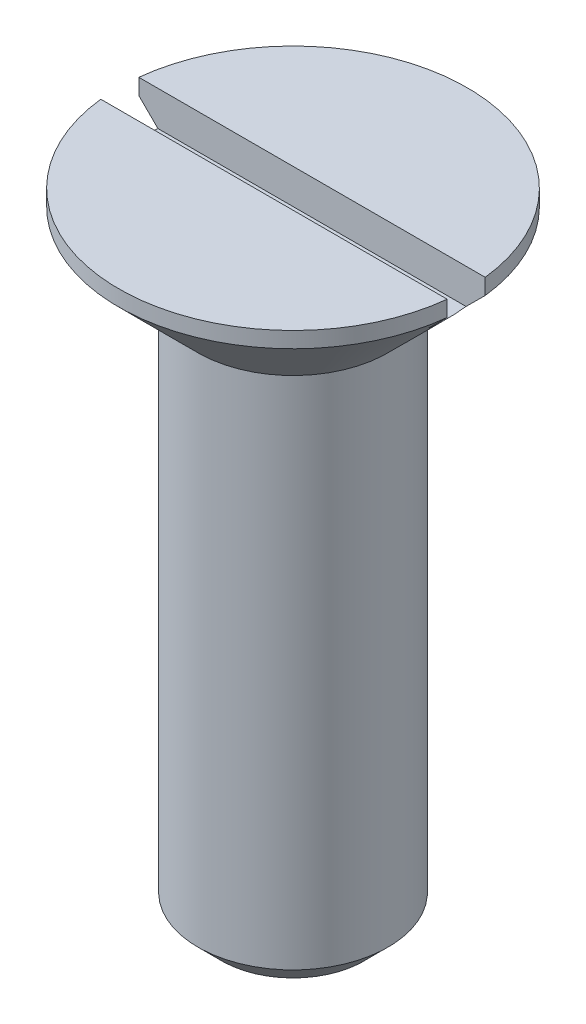
ISO-10303-21;
HEADER;
FILE_DESCRIPTION(('STEP AP214'),'2;1');
FILE_NAME('part.step','',(''),(''),'','','');
FILE_SCHEMA(('AUTOMOTIVE_DESIGN { 1 0 10303 214 1 1 1 1 }'));
ENDSEC;
DATA;
#1=APPLICATION_CONTEXT('core data for automotive mechanical design processes');
#2=APPLICATION_PROTOCOL_DEFINITION('international standard','automotive_design',2000,#1);
#3=PRODUCT_CONTEXT('',#1,'mechanical');
#4=PRODUCT('Part','Part','',(#3));
#5=PRODUCT_RELATED_PRODUCT_CATEGORY('part','',(#4));
#6=PRODUCT_DEFINITION_FORMATION('','',#4);
#7=PRODUCT_DEFINITION_CONTEXT('part definition',#1,'design');
#8=PRODUCT_DEFINITION('design','',#6,#7);
#9=PRODUCT_DEFINITION_SHAPE('','',#8);
#10=(LENGTH_UNIT() NAMED_UNIT(*) SI_UNIT(.MILLI.,.METRE.));
#11=(NAMED_UNIT(*) PLANE_ANGLE_UNIT() SI_UNIT($,.RADIAN.));
#12=(NAMED_UNIT(*) SI_UNIT($,.STERADIAN.) SOLID_ANGLE_UNIT());
#13=UNCERTAINTY_MEASURE_WITH_UNIT(LENGTH_MEASURE(1.E-05),#10,'distance_accuracy_value','');
#14=(GEOMETRIC_REPRESENTATION_CONTEXT(3) GLOBAL_UNCERTAINTY_ASSIGNED_CONTEXT((#13)) GLOBAL_UNIT_ASSIGNED_CONTEXT((#10,
#11,#12)) REPRESENTATION_CONTEXT('',''));
#15=CARTESIAN_POINT('',(0.,0.,0.));
#16=DIRECTION('',(0.,0.,1.));
#17=DIRECTION('',(1.,0.,0.));
#18=AXIS2_PLACEMENT_3D('',#15,#16,#17);
#19=CARTESIAN_POINT('',(0.,125.763182897862,0.));
#20=DIRECTION('',(0.,1.,0.));
#21=DIRECTION('',(-1.,0.,0.));
#22=AXIS2_PLACEMENT_3D('',#19,#20,#21);
#23=CYLINDRICAL_SURFACE('',#22,5.50000000000001);
#24=CARTESIAN_POINT('',(0.,19.5,0.));
#25=DIRECTION('',(0.,1.,0.));
#26=DIRECTION('',(-1.,0.,0.));
#27=AXIS2_PLACEMENT_3D('',#24,#25,#26);
#28=CIRCLE('',#27,5.50000000000001);
#29=CARTESIAN_POINT('',(5.46717477313467,19.5,-0.600000000000001));
#30=VERTEX_POINT('',#29);
#31=CARTESIAN_POINT('',(-5.46717477313467,19.5,-0.599999999999999));
#32=VERTEX_POINT('',#31);
#33=EDGE_CURVE('E101',#30,#32,#28,.T.);
#34=ORIENTED_EDGE('',*,*,#33,.T.);
#35=DIRECTION('',(0.,1.,0.));
#36=VECTOR('',#35,1.);
#37=CARTESIAN_POINT('',(-5.46717477313468,125.763182897862,-0.599999999999999));
#38=LINE('',#37,#36);
#39=CARTESIAN_POINT('',(-5.46717477313467,20.,-0.599999999999999));
#40=VERTEX_POINT('',#39);
#41=EDGE_CURVE('E52',#32,#40,#38,.T.);
#42=ORIENTED_EDGE('',*,*,#41,.T.);
#43=CARTESIAN_POINT('',(0.,20.,0.));
#44=DIRECTION('',(0.,1.,0.));
#45=DIRECTION('',(-1.,0.,0.));
#46=AXIS2_PLACEMENT_3D('',#43,#44,#45);
#47=CIRCLE('',#46,5.50000000000001);
#48=CARTESIAN_POINT('',(5.46717477313467,20.,-0.600000000000001));
#49=VERTEX_POINT('',#48);
#50=EDGE_CURVE('E102',#49,#40,#47,.T.);
#51=ORIENTED_EDGE('',*,*,#50,.F.);
#52=DIRECTION('',(0.,1.,0.));
#53=VECTOR('',#52,1.);
#54=CARTESIAN_POINT('',(5.46717477313466,125.763182897862,-0.600000000000001));
#55=LINE('',#54,#53);
#56=EDGE_CURVE('E138',#49,#30,#55,.F.);
#57=ORIENTED_EDGE('',*,*,#56,.T.);
#58=EDGE_LOOP('',(#34,#42,#51,#57));
#59=FACE_BOUND('',#58,.T.);
#60=ADVANCED_FACE('F29',(#59),#23,.T.);
#61=CARTESIAN_POINT('',(0.,20.,0.));
#62=DIRECTION('',(0.,-1.,0.));
#63=DIRECTION('',(1.,0.,0.));
#64=AXIS2_PLACEMENT_3D('',#61,#62,#63);
#65=PLANE('',#64);
#66=ORIENTED_EDGE('',*,*,#50,.T.);
#67=DIRECTION('',(1.,0.,0.));
#68=VECTOR('',#67,1.);
#69=CARTESIAN_POINT('',(0.,20.,-0.6));
#70=LINE('',#69,#68);
#71=EDGE_CURVE('E88',#40,#49,#70,.T.);
#72=ORIENTED_EDGE('',*,*,#71,.T.);
#73=EDGE_LOOP('',(#66,#72));
#74=FACE_BOUND('',#73,.T.);
#75=ADVANCED_FACE('F149',(#74),#65,.F.);
#76=CARTESIAN_POINT('',(3.,0.,0.));
#77=DIRECTION('',(0.,1.,0.));
#78=DIRECTION('',(-1.,0.,0.));
#79=AXIS2_PLACEMENT_3D('',#76,#77,#78);
#80=PLANE('',#79);
#81=CARTESIAN_POINT('',(0.,0.,0.));
#82=DIRECTION('',(0.,1.,0.));
#83=DIRECTION('',(-1.,0.,0.));
#84=AXIS2_PLACEMENT_3D('',#81,#82,#83);
#85=CIRCLE('',#84,2.25000000000001);
#86=CARTESIAN_POINT('',(-2.25000000000001,0.,0.));
#87=VERTEX_POINT('',#86);
#88=EDGE_CURVE('E11',#87,#87,#85,.F.);
#89=ORIENTED_EDGE('',*,*,#88,.T.);
#90=EDGE_LOOP('',(#89));
#91=FACE_BOUND('',#90,.T.);
#92=ADVANCED_FACE('F31',(#91),#80,.F.);
#93=CARTESIAN_POINT('',(0.,125.763182897862,0.));
#94=DIRECTION('',(0.,1.,0.));
#95=DIRECTION('',(-1.,0.,0.));
#96=AXIS2_PLACEMENT_3D('',#93,#94,#95);
#97=CYLINDRICAL_SURFACE('',#96,3.);
#98=CARTESIAN_POINT('',(0.,0.750000000000001,0.));
#99=DIRECTION('',(0.,1.,0.));
#100=DIRECTION('',(-1.,0.,0.));
#101=AXIS2_PLACEMENT_3D('',#98,#99,#100);
#102=CIRCLE('',#101,3.);
#103=CARTESIAN_POINT('',(-3.,0.75,0.));
#104=VERTEX_POINT('',#103);
#105=EDGE_CURVE('E37',#104,#104,#102,.T.);
#106=ORIENTED_EDGE('',*,*,#105,.T.);
#107=EDGE_LOOP('',(#106));
#108=FACE_BOUND('',#107,.T.);
#109=CARTESIAN_POINT('',(0.,17.,0.));
#110=DIRECTION('',(0.,1.,0.));
#111=DIRECTION('',(-1.,0.,0.));
#112=AXIS2_PLACEMENT_3D('',#109,#110,#111);
#113=CIRCLE('',#112,3.);
#114=CARTESIAN_POINT('',(-3.,17.,0.));
#115=VERTEX_POINT('',#114);
#116=EDGE_CURVE('E89',#115,#115,#113,.T.);
#117=ORIENTED_EDGE('',*,*,#116,.F.);
#118=EDGE_LOOP('',(#117));
#119=FACE_BOUND('',#118,.T.);
#120=ADVANCED_FACE('F157',(#108,#119),#97,.T.);
#121=CARTESIAN_POINT('',(0.,17.,0.));
#122=DIRECTION('',(0.,1.,0.));
#123=DIRECTION('',(-1.,0.,0.));
#124=AXIS2_PLACEMENT_3D('',#121,#122,#123);
#125=CONICAL_SURFACE('',#124,3.,0.785398163397448);
#126=ORIENTED_EDGE('',*,*,#33,.F.);
#127=CARTESIAN_POINT('',(12.0951380212487,26.1100108898818,-0.600000000000001));
#128=CARTESIAN_POINT('',(11.6796656036397,25.6950528945452,-0.600000000000001));
#129=CARTESIAN_POINT('',(11.2641708389118,25.2801172624036,-0.600000000000001));
#130=CARTESIAN_POINT('',(10.4331049381274,24.4503170669954,-0.600000000000001));
#131=CARTESIAN_POINT('',(10.0175338015904,24.03545250421,-0.600000000000001));
#132=CARTESIAN_POINT('',(9.18622716868446,23.2057645935921,-0.600000000000001));
#133=CARTESIAN_POINT('',(8.77049165707136,22.7909412610329,-0.600000000000001));
#134=CARTESIAN_POINT('',(7.93886813876426,21.9614527406175,-0.600000000000001));
#135=CARTESIAN_POINT('',(7.52298013305637,21.5467875517728,-0.600000000000001));
#136=CARTESIAN_POINT('',(6.6854175020873,20.7121942917957,-0.600000000000001));
#137=CARTESIAN_POINT('',(6.26373950689475,20.2922696025233,-0.600000000000001));
#138=CARTESIAN_POINT('',(5.41992863983435,19.4528613612213,-0.600000000000001));
#139=CARTESIAN_POINT('',(4.99779575961435,19.0333778175809,-0.600000000000001));
#140=CARTESIAN_POINT('',(4.36391156708248,18.404882697502,-0.600000000000001));
#141=CARTESIAN_POINT('',(4.15251265775566,18.1955158613068,-0.600000000000001));
#142=CARTESIAN_POINT('',(3.72933777965306,17.777160371771,-0.600000000000001));
#143=CARTESIAN_POINT('',(3.51756180804973,17.5681717212902,-0.6));
#144=CARTESIAN_POINT('',(3.09340508148398,17.1508224904441,-0.6));
#145=CARTESIAN_POINT('',(2.88102434773796,16.9424618885608,-0.6));
#146=CARTESIAN_POINT('',(2.56158400503627,16.6308141336848,-0.6));
#147=CARTESIAN_POINT('',(2.45495967057634,16.5270810371465,-0.6));
#148=CARTESIAN_POINT('',(2.24128558495607,16.3200541476939,-0.6));
#149=CARTESIAN_POINT('',(2.13423583569519,16.2167603528224,-0.6));
#150=CARTESIAN_POINT('',(1.96851539962987,16.0578586549903,-0.6));
#151=CARTESIAN_POINT('',(1.91007314716257,16.0020126221314,-0.6));
#152=CARTESIAN_POINT('',(1.79293848959893,15.8905822939596,-0.6));
#153=CARTESIAN_POINT('',(1.7342460821823,15.8349980010845,-0.6));
#154=CARTESIAN_POINT('',(1.61660382106689,15.7242427997175,-0.6));
#155=CARTESIAN_POINT('',(1.55765435798411,15.6690714772047,-0.6));
#156=CARTESIAN_POINT('',(1.43931126086082,15.5592102515148,-0.6));
#157=CARTESIAN_POINT('',(1.37991763630936,15.504520338107,-0.6));
#158=CARTESIAN_POINT('',(1.2402740725849,15.3773752483312,-0.6));
#159=CARTESIAN_POINT('',(1.15978115908662,15.3051844001292,-0.6));
#160=CARTESIAN_POINT('',(1.03756703794511,15.198399202588,-0.6));
#161=CARTESIAN_POINT('',(0.996536617009663,15.1630156922861,-0.6));
#162=CARTESIAN_POINT('',(0.913852032905214,15.0929951221089,-0.6));
#163=CARTESIAN_POINT('',(0.872197969786392,15.0583579446298,-0.6));
#164=CARTESIAN_POINT('',(0.791299366014582,14.9927928827436,-0.6));
#165=CARTESIAN_POINT('',(0.752119188587601,14.9617859443906,-0.6));
#166=CARTESIAN_POINT('',(0.672759138642564,14.9010823402667,-0.6));
#167=CARTESIAN_POINT('',(0.632579454007321,14.87138543111,-0.6));
#168=CARTESIAN_POINT('',(0.550880301272809,14.8140157080452,-0.6));
#169=CARTESIAN_POINT('',(0.50936307605293,14.7863397363835,-0.6));
#170=CARTESIAN_POINT('',(0.424405599335261,14.7341614805984,-0.6));
#171=CARTESIAN_POINT('',(0.380968213312905,14.709654668264,-0.6));
#172=CARTESIAN_POINT('',(0.297919800401256,14.6690608246886,-0.6));
#173=CARTESIAN_POINT('',(0.258664197958343,14.6522686373426,-0.6));
#174=CARTESIAN_POINT('',(0.178131204845769,14.624755274139,-0.6));
#175=CARTESIAN_POINT('',(0.136863011252717,14.6140088632231,-0.6));
#176=CARTESIAN_POINT('',(0.0597827189723773,14.6019770199271,-0.6));
#177=CARTESIAN_POINT('',(0.0241765819837911,14.5994358265959,-0.6));
#178=CARTESIAN_POINT('',(-0.0468980837664585,14.600779265303,-0.6));
#179=CARTESIAN_POINT('',(-0.0823666288549675,14.6046631100088,-0.6));
#180=CARTESIAN_POINT('',(-0.164228481301684,14.6203530264431,-0.6));
#181=CARTESIAN_POINT('',(-0.21017105901738,14.6344292676086,-0.6));
#182=CARTESIAN_POINT('',(-0.277090527383127,14.6605677965075,-0.6));
#183=CARTESIAN_POINT('',(-0.299133519081207,14.6701577562829,-0.6));
#184=CARTESIAN_POINT('',(-0.342597478729015,14.6906576871152,-0.6));
#185=CARTESIAN_POINT('',(-0.364018609177638,14.7015673094096,-0.6));
#186=CARTESIAN_POINT('',(-0.423927415438599,14.7339230841824,-0.6));
#187=CARTESIAN_POINT('',(-0.461758475752079,14.7565723407774,-0.6));
#188=CARTESIAN_POINT('',(-0.536030570370898,14.8040631010141,-0.6));
#189=CARTESIAN_POINT('',(-0.572470391053765,14.828906458761,-0.6));
#190=CARTESIAN_POINT('',(-0.644393056714348,14.8801156734928,-0.6));
#191=CARTESIAN_POINT('',(-0.679873295058446,14.9064851648074,-0.6));
#192=CARTESIAN_POINT('',(-0.750053102465117,14.9602471413158,-0.6));
#193=CARTESIAN_POINT('',(-0.784752544554466,14.9876397909966,-0.6));
#194=CARTESIAN_POINT('',(-0.888330721356555,15.071186655234,-0.6));
#195=CARTESIAN_POINT('',(-0.956321530602375,15.1284378481806,-0.6));
#196=CARTESIAN_POINT('',(-1.0907761308255,15.2444525317654,-0.6));
#197=CARTESIAN_POINT('',(-1.15724235396909,15.303213242836,-0.6));
#198=CARTESIAN_POINT('',(-1.28834061338832,15.420915220107,-0.6));
#199=CARTESIAN_POINT('',(-1.35298530053589,15.4798424174361,-0.6));
#200=CARTESIAN_POINT('',(-1.48167129148738,15.5983515326857,-0.6));
#201=CARTESIAN_POINT('',(-1.54571258660474,15.6579334600051,-0.6));
#202=CARTESIAN_POINT('',(-1.73721596411782,15.8373626718182,-0.6));
#203=CARTESIAN_POINT('',(-1.86404642355585,15.9578832617011,-0.6));
#204=CARTESIAN_POINT('',(-2.1168924596221,16.1999857175185,-0.6));
#205=CARTESIAN_POINT('',(-2.24290725197354,16.3215683984544,-0.6));
#206=CARTESIAN_POINT('',(-2.49435723427013,16.56531965143,-0.6));
#207=CARTESIAN_POINT('',(-2.61979245120209,16.6874881956391,-0.6));
#208=CARTESIAN_POINT('',(-2.86947718902359,16.9314157091042,-0.6));
#209=CARTESIAN_POINT('',(-2.9937291276874,17.053172206608,-0.6));
#210=CARTESIAN_POINT('',(-3.24197726622141,17.2969485978386,-0.6));
#211=CARTESIAN_POINT('',(-3.36597346293413,17.4189684947798,-0.6));
#212=CARTESIAN_POINT('',(-3.73760673191019,17.785224207157,-0.6));
#213=CARTESIAN_POINT('',(-3.98497092490561,18.0297368100389,-0.6));
#214=CARTESIAN_POINT('',(-4.55885990168457,18.5979470007116,-0.599999999999999));
#215=CARTESIAN_POINT('',(-4.88523369425366,18.921796953734,-0.599999999999999));
#216=CARTESIAN_POINT('',(-5.53759663246657,19.5698850858452,-0.599999999999999));
#217=CARTESIAN_POINT('',(-5.8635857773964,19.8941232656523,-0.599999999999999));
#218=CARTESIAN_POINT('',(-6.84130493557797,20.8672705889862,-0.599999999999999));
#219=CARTESIAN_POINT('',(-7.492694834653,21.5165213634311,-0.599999999999999));
#220=CARTESIAN_POINT('',(-8.80276843924299,22.8230663112805,-0.599999999999999));
#221=CARTESIAN_POINT('',(-9.46144758146029,23.4803650575616,-0.599999999999999));
#222=CARTESIAN_POINT('',(-10.7784760394379,24.7951006116141,-0.599999999999999));
#223=CARTESIAN_POINT('',(-11.4368253893187,25.4525373852029,-0.599999999999999));
#224=CARTESIAN_POINT('',(-12.0951380212487,26.1100108898818,-0.599999999999999));
#225=B_SPLINE_CURVE_WITH_KNOTS('',3,(#127,#128,#129,#130,#131,#132,#133,#134,#135,#136,#137,
#138,#139,#140,#141,#142,#143,#144,#145,#146,#147,#148,#149,#150,#151,#152,#153,#154,#155,#156,
#157,#158,#159,#160,#161,#162,#163,#164,#165,#166,#167,#168,#169,#170,#171,#172,#173,#174,#175,
#176,#177,#178,#179,#180,#181,#182,#183,#184,#185,#186,#187,#188,#189,#190,#191,#192,#193,#194,
#195,#196,#197,#198,#199,#200,#201,#202,#203,#204,#205,#206,#207,#208,#209,#210,#211,#212,#213,
#214,#215,#216,#217,#218,#219,#220,#221,#222,#223,#224),.UNSPECIFIED.,.F.,.F.,(4,2,2,2,2,2,2,2,
2,2,2,2,2,2,2,2,2,2,2,2,2,2,2,2,2,2,2,2,2,2,2,2,2,2,2,2,2,2,2,2,2,2,2,2,2,2,2,2,4),(0.,
1.76160927905883,3.52323004831132,5.28511246320159,7.0469836788077,8.83229635368215,
10.6176423870645,11.5102313775106,12.4028270897961,13.2953918644129,13.7416688038841,
14.1879437529796,14.4304477398364,14.6729539809372,14.9151709434148,15.1573827458842,
15.4817260735393,15.6442607048621,15.8067695345603,15.956647211626,16.1064969251415,
16.2561072500143,16.4055013869819,16.5332849812819,16.660531172842,16.7670545380187,
16.8735648506512,17.0168065075244,17.0889012703616,17.1609770213314,17.2931273119173,
17.4253903634111,17.557982498196,17.6905960415438,17.9571939667025,18.2233319331036,
18.4857404711835,18.7481527811992,19.2730225012347,19.7983383561434,20.3236294991337,
20.8455185947243,21.367414095637,22.4108588649777,23.7902015875586,25.1695468664323,
27.9286256080477,30.7202377901635,33.511442272455),.UNSPECIFIED.);
#226=CARTESIAN_POINT('',(4.86312656631513,18.9,-0.600000000000001));
#227=VERTEX_POINT('',#226);
#228=EDGE_CURVE('E132',#30,#227,#225,.T.);
#229=ORIENTED_EDGE('',*,*,#228,.T.);
#230=CARTESIAN_POINT('',(0.,18.9,0.));
#231=DIRECTION('',(0.,1.,0.));
#232=DIRECTION('',(0.,0.,1.));
#233=AXIS2_PLACEMENT_3D('',#230,#231,#232);
#234=CIRCLE('',#233,4.9);
#235=CARTESIAN_POINT('',(4.86312656631513,18.9,0.599999999999999));
#236=VERTEX_POINT('',#235);
#237=EDGE_CURVE('E116',#236,#227,#234,.T.);
#238=ORIENTED_EDGE('',*,*,#237,.F.);
#239=CARTESIAN_POINT('',(-12.0951380212487,26.1100108898818,0.600000000000001));
#240=CARTESIAN_POINT('',(-11.6796656036397,25.6950528945452,0.600000000000001));
#241=CARTESIAN_POINT('',(-11.2641708389118,25.2801172624036,0.600000000000001));
#242=CARTESIAN_POINT('',(-10.4331049381274,24.4503170669954,0.600000000000001));
#243=CARTESIAN_POINT('',(-10.0175338015904,24.03545250421,0.600000000000001));
#244=CARTESIAN_POINT('',(-9.18622716868448,23.2057645935921,0.600000000000001));
#245=CARTESIAN_POINT('',(-8.77049165707138,22.7909412610329,0.600000000000001));
#246=CARTESIAN_POINT('',(-7.93886813876427,21.9614527406175,0.600000000000001));
#247=CARTESIAN_POINT('',(-7.52298013305639,21.5467875517728,0.600000000000001));
#248=CARTESIAN_POINT('',(-6.68541750208731,20.7121942917957,0.600000000000001));
#249=CARTESIAN_POINT('',(-6.26373950689476,20.2922696025233,0.600000000000001));
#250=CARTESIAN_POINT('',(-5.41992863983436,19.4528613612213,0.600000000000001));
#251=CARTESIAN_POINT('',(-4.99779575961436,19.0333778175809,0.6));
#252=CARTESIAN_POINT('',(-4.36391156708248,18.404882697502,0.6));
#253=CARTESIAN_POINT('',(-4.15251265775567,18.1955158613068,0.6));
#254=CARTESIAN_POINT('',(-3.72933777965306,17.777160371771,0.6));
#255=CARTESIAN_POINT('',(-3.51756180804973,17.5681717212902,0.6));
#256=CARTESIAN_POINT('',(-3.09340508148398,17.1508224904441,0.6));
#257=CARTESIAN_POINT('',(-2.88102434773797,16.9424618885608,0.6));
#258=CARTESIAN_POINT('',(-2.56158400503627,16.6308141336848,0.6));
#259=CARTESIAN_POINT('',(-2.45495967057633,16.5270810371465,0.6));
#260=CARTESIAN_POINT('',(-2.24128558495607,16.3200541476939,0.6));
#261=CARTESIAN_POINT('',(-2.13423583569519,16.2167603528224,0.6));
#262=CARTESIAN_POINT('',(-1.96851539962987,16.0578586549902,0.6));
#263=CARTESIAN_POINT('',(-1.91007314716257,16.0020126221314,0.6));
#264=CARTESIAN_POINT('',(-1.79293848959893,15.8905822939596,0.6));
#265=CARTESIAN_POINT('',(-1.7342460821823,15.8349980010845,0.6));
#266=CARTESIAN_POINT('',(-1.61660382106689,15.7242427997175,0.6));
#267=CARTESIAN_POINT('',(-1.55765435798411,15.6690714772047,0.6));
#268=CARTESIAN_POINT('',(-1.43931126086082,15.5592102515148,0.6));
#269=CARTESIAN_POINT('',(-1.37991763630936,15.504520338107,0.6));
#270=CARTESIAN_POINT('',(-1.2402740725849,15.3773752483312,0.6));
#271=CARTESIAN_POINT('',(-1.15978115908661,15.3051844001292,0.6));
#272=CARTESIAN_POINT('',(-1.03756703794511,15.198399202588,0.6));
#273=CARTESIAN_POINT('',(-0.996536617009661,15.1630156922861,0.6));
#274=CARTESIAN_POINT('',(-0.913852032905213,15.0929951221089,0.6));
#275=CARTESIAN_POINT('',(-0.872197969786392,15.0583579446298,0.6));
#276=CARTESIAN_POINT('',(-0.791299366014583,14.9927928827436,0.6));
#277=CARTESIAN_POINT('',(-0.752119188587603,14.9617859443906,0.6));
#278=CARTESIAN_POINT('',(-0.672759138642567,14.9010823402667,0.6));
#279=CARTESIAN_POINT('',(-0.632579454007324,14.87138543111,0.6));
#280=CARTESIAN_POINT('',(-0.550880301272813,14.8140157080452,0.6));
#281=CARTESIAN_POINT('',(-0.509363076052934,14.7863397363835,0.6));
#282=CARTESIAN_POINT('',(-0.424405599335265,14.7341614805984,0.6));
#283=CARTESIAN_POINT('',(-0.38096821331291,14.709654668264,0.6));
#284=CARTESIAN_POINT('',(-0.297919800401262,14.6690608246886,0.6));
#285=CARTESIAN_POINT('',(-0.258664197958348,14.6522686373426,0.6));
#286=CARTESIAN_POINT('',(-0.178131204845774,14.624755274139,0.6));
#287=CARTESIAN_POINT('',(-0.136863011252723,14.6140088632231,0.6));
#288=CARTESIAN_POINT('',(-0.0597827189723839,14.6019770199271,0.6));
#289=CARTESIAN_POINT('',(-0.0241765819837977,14.5994358265959,0.6));
#290=CARTESIAN_POINT('',(0.0468980837664518,14.600779265303,0.6));
#291=CARTESIAN_POINT('',(0.0823666288549606,14.6046631100088,0.6));
#292=CARTESIAN_POINT('',(0.164228481301676,14.6203530264431,0.6));
#293=CARTESIAN_POINT('',(0.210171059017371,14.6344292676086,0.6));
#294=CARTESIAN_POINT('',(0.277090527383117,14.6605677965075,0.6));
#295=CARTESIAN_POINT('',(0.299133519081196,14.6701577562829,0.6));
#296=CARTESIAN_POINT('',(0.342597478729005,14.6906576871152,0.6));
#297=CARTESIAN_POINT('',(0.364018609177628,14.7015673094096,0.6));
#298=CARTESIAN_POINT('',(0.423927415438588,14.7339230841824,0.6));
#299=CARTESIAN_POINT('',(0.461758475752066,14.7565723407774,0.6));
#300=CARTESIAN_POINT('',(0.536030570370882,14.8040631010141,0.6));
#301=CARTESIAN_POINT('',(0.572470391053749,14.828906458761,0.6));
#302=CARTESIAN_POINT('',(0.644393056714329,14.8801156734928,0.6));
#303=CARTESIAN_POINT('',(0.679873295058427,14.9064851648073,0.6));
#304=CARTESIAN_POINT('',(0.750053102465096,14.9602471413157,0.6));
#305=CARTESIAN_POINT('',(0.784752544554446,14.9876397909966,0.6));
#306=CARTESIAN_POINT('',(0.888330721356532,15.071186655234,0.6));
#307=CARTESIAN_POINT('',(0.956321530602351,15.1284378481806,0.6));
#308=CARTESIAN_POINT('',(1.09077613082547,15.2444525317654,0.6));
#309=CARTESIAN_POINT('',(1.15724235396906,15.303213242836,0.6));
#310=CARTESIAN_POINT('',(1.28834061338828,15.4209152201069,0.6));
#311=CARTESIAN_POINT('',(1.35298530053585,15.479842417436,0.6));
#312=CARTESIAN_POINT('',(1.48167129148734,15.5983515326856,0.6));
#313=CARTESIAN_POINT('',(1.54571258660469,15.6579334600051,0.6));
#314=CARTESIAN_POINT('',(1.73721596411777,15.8373626718181,0.6));
#315=CARTESIAN_POINT('',(1.8640464235558,15.957883261701,0.6));
#316=CARTESIAN_POINT('',(2.11689245962204,16.1999857175185,0.6));
#317=CARTESIAN_POINT('',(2.24290725197347,16.3215683984544,0.6));
#318=CARTESIAN_POINT('',(2.49435723427005,16.5653196514299,0.6));
#319=CARTESIAN_POINT('',(2.61979245120201,16.687488195639,0.6));
#320=CARTESIAN_POINT('',(2.86947718902351,16.9314157091042,0.6));
#321=CARTESIAN_POINT('',(2.99372912768731,17.0531722066079,0.6));
#322=CARTESIAN_POINT('',(3.24197726622132,17.2969485978385,0.6));
#323=CARTESIAN_POINT('',(3.36597346293403,17.4189684947797,0.6));
#324=CARTESIAN_POINT('',(3.73760673191008,17.7852242071569,0.6));
#325=CARTESIAN_POINT('',(3.98497092490549,18.0297368100387,0.599999999999999));
#326=CARTESIAN_POINT('',(4.55885990168445,18.5979470007115,0.599999999999999));
#327=CARTESIAN_POINT('',(4.88523369425354,18.9217969537339,0.599999999999999));
#328=CARTESIAN_POINT('',(5.53759663246646,19.5698850858451,0.599999999999999));
#329=CARTESIAN_POINT('',(5.8635857773963,19.8941232656522,0.599999999999999));
#330=CARTESIAN_POINT('',(6.84130493557787,20.8672705889861,0.599999999999999));
#331=CARTESIAN_POINT('',(7.49269483465292,21.5165213634311,0.599999999999999));
#332=CARTESIAN_POINT('',(8.80276843924293,22.8230663112804,0.599999999999999));
#333=CARTESIAN_POINT('',(9.46144758146024,23.4803650575616,0.599999999999999));
#334=CARTESIAN_POINT('',(10.7784760394379,24.7951006116141,0.599999999999999));
#335=CARTESIAN_POINT('',(11.4368253893187,25.4525373852028,0.599999999999999));
#336=CARTESIAN_POINT('',(12.0951380212487,26.1100108898818,0.599999999999998));
#337=B_SPLINE_CURVE_WITH_KNOTS('',3,(#239,#240,#241,#242,#243,#244,#245,#246,#247,#248,#249,
#250,#251,#252,#253,#254,#255,#256,#257,#258,#259,#260,#261,#262,#263,#264,#265,#266,#267,#268,
#269,#270,#271,#272,#273,#274,#275,#276,#277,#278,#279,#280,#281,#282,#283,#284,#285,#286,#287,
#288,#289,#290,#291,#292,#293,#294,#295,#296,#297,#298,#299,#300,#301,#302,#303,#304,#305,#306,
#307,#308,#309,#310,#311,#312,#313,#314,#315,#316,#317,#318,#319,#320,#321,#322,#323,#324,#325,
#326,#327,#328,#329,#330,#331,#332,#333,#334,#335,#336),.UNSPECIFIED.,.F.,.F.,(4,2,2,2,2,2,2,2,
2,2,2,2,2,2,2,2,2,2,2,2,2,2,2,2,2,2,2,2,2,2,2,2,2,2,2,2,2,2,2,2,2,2,2,2,2,2,2,2,4),(0.,
1.76160927905883,3.52323004831131,5.28511246320157,7.04698367880768,8.83229635368214,
10.6176423870645,11.5102313775106,12.4028270897961,13.2953918644129,13.7416688038841,
14.1879437529796,14.4304477398364,14.6729539809372,14.9151709434148,15.1573827458843,
15.4817260735393,15.6442607048621,15.8067695345603,15.956647211626,16.1064969251415,
16.2561072500143,16.4055013869819,16.5332849812819,16.660531172842,16.7670545380187,
16.8735648506512,17.0168065075244,17.0889012703616,17.1609770213314,17.2931273119173,
17.4253903634111,17.557982498196,17.6905960415438,17.9571939667025,18.2233319331036,
18.4857404711835,18.7481527811992,19.2730225012347,19.7983383561433,20.3236294991336,
20.8455185947242,21.3674140956368,22.4108588649776,23.7902015875584,25.1695468664322,
27.9286256080476,30.7202377901635,33.511442272455),.UNSPECIFIED.);
#338=CARTESIAN_POINT('',(5.46717477313467,19.5,0.599999999999999));
#339=VERTEX_POINT('',#338);
#340=EDGE_CURVE('E97',#236,#339,#337,.T.);
#341=ORIENTED_EDGE('',*,*,#340,.T.);
#342=CARTESIAN_POINT('',(-5.46717477313467,19.5,0.600000000000001));
#343=VERTEX_POINT('',#342);
#344=EDGE_CURVE('E96',#343,#339,#28,.T.);
#345=ORIENTED_EDGE('',*,*,#344,.F.);
#346=CARTESIAN_POINT('',(-4.86312656631513,18.9,0.6));
#347=VERTEX_POINT('',#346);
#348=EDGE_CURVE('E98',#343,#347,#337,.T.);
#349=ORIENTED_EDGE('',*,*,#348,.T.);
#350=CARTESIAN_POINT('',(-4.86312656631513,18.9,-0.6));
#351=VERTEX_POINT('',#350);
#352=EDGE_CURVE('E115',#351,#347,#234,.T.);
#353=ORIENTED_EDGE('',*,*,#352,.F.);
#354=EDGE_CURVE('E107',#351,#32,#225,.T.);
#355=ORIENTED_EDGE('',*,*,#354,.T.);
#356=EDGE_LOOP('',(#126,#229,#238,#341,#345,#349,#353,#355));
#357=FACE_BOUND('',#356,.T.);
#358=ORIENTED_EDGE('',*,*,#116,.T.);
#359=EDGE_LOOP('',(#358));
#360=FACE_BOUND('',#359,.T.);
#361=ADVANCED_FACE('F136',(#357,#360),#125,.T.);
#362=ORIENTED_EDGE('',*,*,#344,.T.);
#363=DIRECTION('',(0.,1.,0.));
#364=VECTOR('',#363,1.);
#365=CARTESIAN_POINT('',(5.46717477313466,125.763182897862,0.599999999999999));
#366=LINE('',#365,#364);
#367=CARTESIAN_POINT('',(5.46717477313467,20.,0.599999999999999));
#368=VERTEX_POINT('',#367);
#369=EDGE_CURVE('E83',#339,#368,#366,.T.);
#370=ORIENTED_EDGE('',*,*,#369,.T.);
#371=CARTESIAN_POINT('',(-5.46717477313467,20.,0.600000000000001));
#372=VERTEX_POINT('',#371);
#373=EDGE_CURVE('E94',#372,#368,#47,.T.);
#374=ORIENTED_EDGE('',*,*,#373,.F.);
#375=DIRECTION('',(0.,1.,0.));
#376=VECTOR('',#375,1.);
#377=CARTESIAN_POINT('',(-5.46717477313468,125.763182897862,0.600000000000001));
#378=LINE('',#377,#376);
#379=EDGE_CURVE('E44',#372,#343,#378,.F.);
#380=ORIENTED_EDGE('',*,*,#379,.T.);
#381=EDGE_LOOP('',(#362,#370,#374,#380));
#382=FACE_BOUND('',#381,.T.);
#383=ADVANCED_FACE('F93',(#382),#23,.T.);
#384=ORIENTED_EDGE('',*,*,#373,.T.);
#385=DIRECTION('',(-1.,0.,0.));
#386=VECTOR('',#385,1.);
#387=CARTESIAN_POINT('',(0.,20.,0.6));
#388=LINE('',#387,#386);
#389=EDGE_CURVE('E79',#368,#372,#388,.T.);
#390=ORIENTED_EDGE('',*,*,#389,.T.);
#391=EDGE_LOOP('',(#384,#390));
#392=FACE_BOUND('',#391,.T.);
#393=ADVANCED_FACE('F100',(#392),#65,.F.);
#394=CARTESIAN_POINT('',(-6.,18.9,0.600000000000001));
#395=DIRECTION('',(0.,1.,0.));
#396=DIRECTION('',(0.,0.,1.));
#397=AXIS2_PLACEMENT_3D('',#394,#395,#396);
#398=PLANE('',#397);
#399=ORIENTED_EDGE('',*,*,#237,.T.);
#400=DIRECTION('',(-1.,0.,0.));
#401=VECTOR('',#400,1.);
#402=CARTESIAN_POINT('',(-6.,18.9,-0.599999999999999));
#403=LINE('',#402,#401);
#404=EDGE_CURVE('E126',#227,#351,#403,.T.);
#405=ORIENTED_EDGE('',*,*,#404,.T.);
#406=ORIENTED_EDGE('',*,*,#352,.T.);
#407=DIRECTION('',(1.,0.,0.));
#408=VECTOR('',#407,1.);
#409=CARTESIAN_POINT('',(-6.,18.9,0.600000000000001));
#410=LINE('',#409,#408);
#411=EDGE_CURVE('E128',#347,#236,#410,.T.);
#412=ORIENTED_EDGE('',*,*,#411,.T.);
#413=EDGE_LOOP('',(#399,#405,#406,#412));
#414=FACE_BOUND('',#413,.T.);
#415=ADVANCED_FACE('F125',(#414),#398,.T.);
#416=CARTESIAN_POINT('',(-6.,18.9,-0.599999999999999));
#417=DIRECTION('',(0.,0.,-1.));
#418=DIRECTION('',(-1.,0.,0.));
#419=AXIS2_PLACEMENT_3D('',#416,#417,#418);
#420=PLANE('',#419);
#421=ORIENTED_EDGE('',*,*,#404,.F.);
#422=ORIENTED_EDGE('',*,*,#228,.F.);
#423=ORIENTED_EDGE('',*,*,#56,.F.);
#424=ORIENTED_EDGE('',*,*,#71,.F.);
#425=ORIENTED_EDGE('',*,*,#41,.F.);
#426=ORIENTED_EDGE('',*,*,#354,.F.);
#427=EDGE_LOOP('',(#421,#422,#423,#424,#425,#426));
#428=FACE_BOUND('',#427,.T.);
#429=ADVANCED_FACE('F131',(#428),#420,.F.);
#430=CARTESIAN_POINT('',(-6.,18.9,0.600000000000001));
#431=DIRECTION('',(0.,0.,1.));
#432=DIRECTION('',(1.,0.,0.));
#433=AXIS2_PLACEMENT_3D('',#430,#431,#432);
#434=PLANE('',#433);
#435=ORIENTED_EDGE('',*,*,#411,.F.);
#436=ORIENTED_EDGE('',*,*,#348,.F.);
#437=ORIENTED_EDGE('',*,*,#379,.F.);
#438=ORIENTED_EDGE('',*,*,#389,.F.);
#439=ORIENTED_EDGE('',*,*,#369,.F.);
#440=ORIENTED_EDGE('',*,*,#340,.F.);
#441=EDGE_LOOP('',(#435,#436,#437,#438,#439,#440));
#442=FACE_BOUND('',#441,.T.);
#443=ADVANCED_FACE('F82',(#442),#434,.F.);
#444=CARTESIAN_POINT('',(0.,0.750000000000001,0.));
#445=DIRECTION('',(0.,1.,0.));
#446=DIRECTION('',(-1.,0.,0.));
#447=AXIS2_PLACEMENT_3D('',#444,#445,#446);
#448=CONICAL_SURFACE('',#447,3.,0.785398163397444);
#449=ORIENTED_EDGE('',*,*,#88,.F.);
#450=EDGE_LOOP('',(#449));
#451=FACE_BOUND('',#450,.T.);
#452=ORIENTED_EDGE('',*,*,#105,.F.);
#453=EDGE_LOOP('',(#452));
#454=FACE_BOUND('',#453,.T.);
#455=ADVANCED_FACE('F178',(#451,#454),#448,.T.);
#456=CLOSED_SHELL('',(#60,#75,#92,#120,#361,#383,#393,#415,#429,#443,#455));
#457=MANIFOLD_SOLID_BREP('B2',#456);
#458=ADVANCED_BREP_SHAPE_REPRESENTATION('',(#18,#457),#14);
#459=SHAPE_DEFINITION_REPRESENTATION(#9,#458);
ENDSEC;
END-ISO-10303-21;
